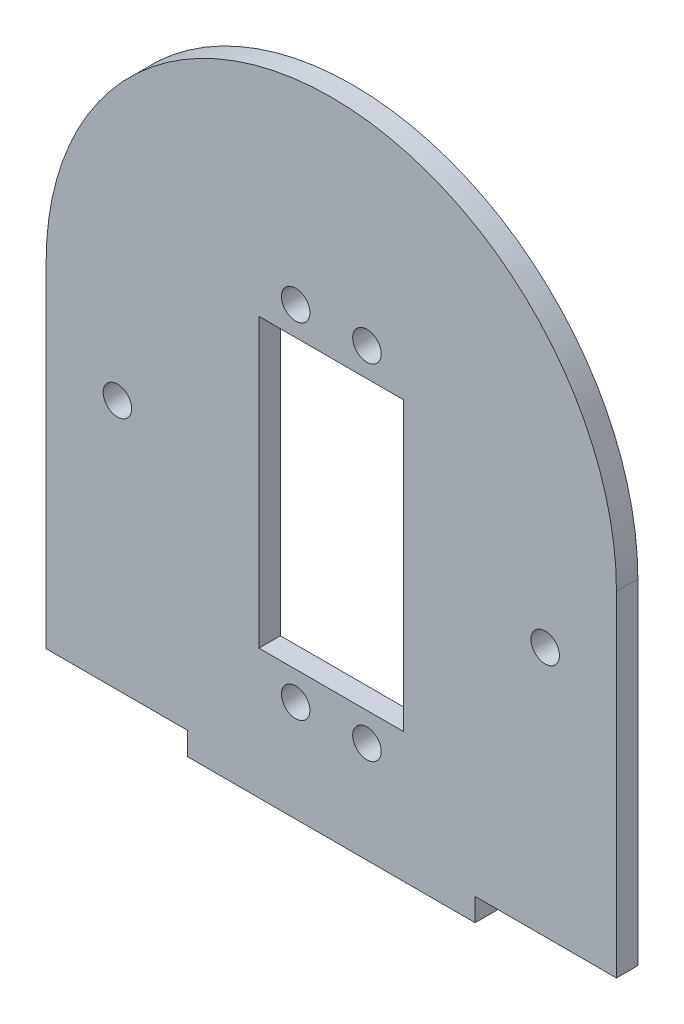
ISO-10303-21;
HEADER;
FILE_DESCRIPTION(('STEP AP214'),'2;1');
FILE_NAME('part.step','',(''),(''),'','','');
FILE_SCHEMA(('AUTOMOTIVE_DESIGN { 1 0 10303 214 1 1 1 1 }'));
ENDSEC;
DATA;
#1=APPLICATION_CONTEXT('core data for automotive mechanical design processes');
#2=APPLICATION_PROTOCOL_DEFINITION('international standard','automotive_design',2000,#1);
#3=PRODUCT_CONTEXT('',#1,'mechanical');
#4=PRODUCT('Part','Part','',(#3));
#5=PRODUCT_RELATED_PRODUCT_CATEGORY('part','',(#4));
#6=PRODUCT_DEFINITION_FORMATION('','',#4);
#7=PRODUCT_DEFINITION_CONTEXT('part definition',#1,'design');
#8=PRODUCT_DEFINITION('design','',#6,#7);
#9=PRODUCT_DEFINITION_SHAPE('','',#8);
#10=(LENGTH_UNIT() NAMED_UNIT(*) SI_UNIT(.MILLI.,.METRE.));
#11=(NAMED_UNIT(*) PLANE_ANGLE_UNIT() SI_UNIT($,.RADIAN.));
#12=(NAMED_UNIT(*) SI_UNIT($,.STERADIAN.) SOLID_ANGLE_UNIT());
#13=UNCERTAINTY_MEASURE_WITH_UNIT(LENGTH_MEASURE(1.E-05),#10,'distance_accuracy_value','');
#14=(GEOMETRIC_REPRESENTATION_CONTEXT(3) GLOBAL_UNCERTAINTY_ASSIGNED_CONTEXT((#13)) GLOBAL_UNIT_ASSIGNED_CONTEXT((#10,
#11,#12)) REPRESENTATION_CONTEXT('',''));
#15=CARTESIAN_POINT('',(0.,0.,0.));
#16=DIRECTION('',(0.,0.,1.));
#17=DIRECTION('',(1.,0.,0.));
#18=AXIS2_PLACEMENT_3D('',#15,#16,#17);
#19=CARTESIAN_POINT('',(0.,0.,3.));
#20=DIRECTION('',(0.,0.,1.));
#21=DIRECTION('',(1.,0.,0.));
#22=AXIS2_PLACEMENT_3D('',#19,#20,#21);
#23=PLANE('',#22);
#24=CARTESIAN_POINT('',(-30.,-11.85,3.));
#25=DIRECTION('',(0.,0.,1.));
#26=DIRECTION('',(1.,0.,0.));
#27=AXIS2_PLACEMENT_3D('',#24,#25,#26);
#28=CIRCLE('',#27,2.);
#29=CARTESIAN_POINT('',(-28.,-11.85,3.));
#30=VERTEX_POINT('',#29);
#31=EDGE_CURVE('E375',#30,#30,#28,.T.);
#32=ORIENTED_EDGE('',*,*,#31,.F.);
#33=EDGE_LOOP('',(#32));
#34=FACE_BOUND('',#33,.T.);
#35=CARTESIAN_POINT('',(5.,-36.,3.));
#36=DIRECTION('',(0.,0.,1.));
#37=DIRECTION('',(1.,0.,0.));
#38=AXIS2_PLACEMENT_3D('',#35,#36,#37);
#39=CIRCLE('',#38,2.);
#40=CARTESIAN_POINT('',(7.,-36.,3.));
#41=VERTEX_POINT('',#40);
#42=EDGE_CURVE('E391',#41,#41,#39,.T.);
#43=ORIENTED_EDGE('',*,*,#42,.F.);
#44=EDGE_LOOP('',(#43));
#45=FACE_BOUND('',#44,.T.);
#46=CARTESIAN_POINT('',(-5.,12.3,3.));
#47=DIRECTION('',(0.,0.,1.));
#48=DIRECTION('',(1.,0.,0.));
#49=AXIS2_PLACEMENT_3D('',#46,#47,#48);
#50=CIRCLE('',#49,2.);
#51=CARTESIAN_POINT('',(-3.,12.3,3.));
#52=VERTEX_POINT('',#51);
#53=EDGE_CURVE('E168',#52,#52,#50,.T.);
#54=ORIENTED_EDGE('',*,*,#53,.F.);
#55=EDGE_LOOP('',(#54));
#56=FACE_BOUND('',#55,.T.);
#57=DIRECTION('',(1.,0.,0.));
#58=VECTOR('',#57,1.);
#59=CARTESIAN_POINT('',(-40.,-47.,3.));
#60=LINE('',#59,#58);
#61=CARTESIAN_POINT('',(-40.,-47.,3.));
#62=VERTEX_POINT('',#61);
#63=CARTESIAN_POINT('',(-20.175,-47.,3.));
#64=VERTEX_POINT('',#63);
#65=EDGE_CURVE('E184',#62,#64,#60,.T.);
#66=ORIENTED_EDGE('',*,*,#65,.T.);
#67=DIRECTION('',(0.,-1.,0.));
#68=VECTOR('',#67,1.);
#69=CARTESIAN_POINT('',(-20.175,-47.,3.));
#70=LINE('',#69,#68);
#71=CARTESIAN_POINT('',(-20.175,-50.2,3.));
#72=VERTEX_POINT('',#71);
#73=EDGE_CURVE('E188',#64,#72,#70,.T.);
#74=ORIENTED_EDGE('',*,*,#73,.T.);
#75=DIRECTION('',(1.,0.,0.));
#76=VECTOR('',#75,1.);
#77=CARTESIAN_POINT('',(-20.175,-50.2,3.));
#78=LINE('',#77,#76);
#79=CARTESIAN_POINT('',(20.175,-50.2,3.));
#80=VERTEX_POINT('',#79);
#81=EDGE_CURVE('E192',#72,#80,#78,.T.);
#82=ORIENTED_EDGE('',*,*,#81,.T.);
#83=DIRECTION('',(0.,1.,0.));
#84=VECTOR('',#83,1.);
#85=CARTESIAN_POINT('',(20.175,-50.2,3.));
#86=LINE('',#85,#84);
#87=CARTESIAN_POINT('',(20.175,-47.,3.));
#88=VERTEX_POINT('',#87);
#89=EDGE_CURVE('E195',#80,#88,#86,.T.);
#90=ORIENTED_EDGE('',*,*,#89,.T.);
#91=DIRECTION('',(1.,0.,0.));
#92=VECTOR('',#91,1.);
#93=CARTESIAN_POINT('',(20.175,-47.,3.));
#94=LINE('',#93,#92);
#95=CARTESIAN_POINT('',(40.,-47.,3.));
#96=VERTEX_POINT('',#95);
#97=EDGE_CURVE('E198',#88,#96,#94,.T.);
#98=ORIENTED_EDGE('',*,*,#97,.T.);
#99=DIRECTION('',(0.,1.,0.));
#100=VECTOR('',#99,1.);
#101=CARTESIAN_POINT('',(40.,0.,3.));
#102=LINE('',#101,#100);
#103=CARTESIAN_POINT('',(40.,0.,3.));
#104=VERTEX_POINT('',#103);
#105=EDGE_CURVE('E201',#96,#104,#102,.T.);
#106=ORIENTED_EDGE('',*,*,#105,.T.);
#107=CARTESIAN_POINT('',(0.,0.,3.));
#108=DIRECTION('',(0.,0.,1.));
#109=DIRECTION('',(1.,0.,0.));
#110=AXIS2_PLACEMENT_3D('',#107,#108,#109);
#111=CIRCLE('',#110,40.);
#112=CARTESIAN_POINT('',(-40.,0.,3.));
#113=VERTEX_POINT('',#112);
#114=EDGE_CURVE('E204',#104,#113,#111,.T.);
#115=ORIENTED_EDGE('',*,*,#114,.T.);
#116=DIRECTION('',(0.,-1.,0.));
#117=VECTOR('',#116,1.);
#118=CARTESIAN_POINT('',(-40.,0.,3.));
#119=LINE('',#118,#117);
#120=EDGE_CURVE('E207',#113,#62,#119,.T.);
#121=ORIENTED_EDGE('',*,*,#120,.T.);
#122=EDGE_LOOP('',(#66,#74,#82,#90,#98,#106,#115,#121));
#123=FACE_BOUND('',#122,.T.);
#124=DIRECTION('',(-1.,0.,0.));
#125=VECTOR('',#124,1.);
#126=CARTESIAN_POINT('',(-10.15,8.3,3.));
#127=LINE('',#126,#125);
#128=CARTESIAN_POINT('',(10.15,8.3,3.));
#129=VERTEX_POINT('',#128);
#130=CARTESIAN_POINT('',(-10.15,8.3,3.));
#131=VERTEX_POINT('',#130);
#132=EDGE_CURVE('E142',#129,#131,#127,.T.);
#133=ORIENTED_EDGE('',*,*,#132,.F.);
#134=DIRECTION('',(0.,1.,0.));
#135=VECTOR('',#134,1.);
#136=CARTESIAN_POINT('',(10.15,8.3,3.));
#137=LINE('',#136,#135);
#138=CARTESIAN_POINT('',(10.15,-32.,3.));
#139=VERTEX_POINT('',#138);
#140=EDGE_CURVE('E133',#139,#129,#137,.T.);
#141=ORIENTED_EDGE('',*,*,#140,.F.);
#142=DIRECTION('',(1.,0.,0.));
#143=VECTOR('',#142,1.);
#144=CARTESIAN_POINT('',(-10.15,-32.,3.));
#145=LINE('',#144,#143);
#146=CARTESIAN_POINT('',(-10.15,-32.,3.));
#147=VERTEX_POINT('',#146);
#148=EDGE_CURVE('E160',#147,#139,#145,.T.);
#149=ORIENTED_EDGE('',*,*,#148,.F.);
#150=DIRECTION('',(0.,-1.,0.));
#151=VECTOR('',#150,1.);
#152=CARTESIAN_POINT('',(-10.15,8.3,3.));
#153=LINE('',#152,#151);
#154=EDGE_CURVE('E156',#131,#147,#153,.T.);
#155=ORIENTED_EDGE('',*,*,#154,.F.);
#156=EDGE_LOOP('',(#133,#141,#149,#155));
#157=FACE_BOUND('',#156,.T.);
#158=CARTESIAN_POINT('',(5.,12.3,3.));
#159=DIRECTION('',(0.,0.,1.));
#160=DIRECTION('',(-1.,0.,0.));
#161=AXIS2_PLACEMENT_3D('',#158,#159,#160);
#162=CIRCLE('',#161,2.);
#163=CARTESIAN_POINT('',(3.,12.3,3.));
#164=VERTEX_POINT('',#163);
#165=EDGE_CURVE('E399',#164,#164,#162,.T.);
#166=ORIENTED_EDGE('',*,*,#165,.F.);
#167=EDGE_LOOP('',(#166));
#168=FACE_BOUND('',#167,.T.);
#169=CARTESIAN_POINT('',(-5.,-36.,3.));
#170=DIRECTION('',(0.,0.,1.));
#171=DIRECTION('',(-1.,0.,0.));
#172=AXIS2_PLACEMENT_3D('',#169,#170,#171);
#173=CIRCLE('',#172,2.);
#174=CARTESIAN_POINT('',(-7.,-36.,3.));
#175=VERTEX_POINT('',#174);
#176=EDGE_CURVE('E383',#175,#175,#173,.T.);
#177=ORIENTED_EDGE('',*,*,#176,.F.);
#178=EDGE_LOOP('',(#177));
#179=FACE_BOUND('',#178,.T.);
#180=CARTESIAN_POINT('',(30.,-11.85,3.));
#181=DIRECTION('',(0.,0.,1.));
#182=DIRECTION('',(-1.,0.,0.));
#183=AXIS2_PLACEMENT_3D('',#180,#181,#182);
#184=CIRCLE('',#183,2.00000000000001);
#185=CARTESIAN_POINT('',(28.,-11.85,3.));
#186=VERTEX_POINT('',#185);
#187=EDGE_CURVE('E364',#186,#186,#184,.T.);
#188=ORIENTED_EDGE('',*,*,#187,.F.);
#189=EDGE_LOOP('',(#188));
#190=FACE_BOUND('',#189,.T.);
#191=ADVANCED_FACE('F43',(#34,#45,#56,#123,#157,#168,#179,#190),#23,.T.);
#192=CARTESIAN_POINT('',(0.,0.,0.));
#193=DIRECTION('',(0.,0.,1.));
#194=DIRECTION('',(1.,0.,0.));
#195=AXIS2_PLACEMENT_3D('',#192,#193,#194);
#196=PLANE('',#195);
#197=DIRECTION('',(1.,0.,0.));
#198=VECTOR('',#197,1.);
#199=CARTESIAN_POINT('',(-40.,-47.,0.));
#200=LINE('',#199,#198);
#201=CARTESIAN_POINT('',(-40.,-47.,0.));
#202=VERTEX_POINT('',#201);
#203=CARTESIAN_POINT('',(-20.175,-47.,0.));
#204=VERTEX_POINT('',#203);
#205=EDGE_CURVE('E151',#202,#204,#200,.T.);
#206=ORIENTED_EDGE('',*,*,#205,.F.);
#207=DIRECTION('',(0.,-1.,0.));
#208=VECTOR('',#207,1.);
#209=CARTESIAN_POINT('',(-40.,0.,0.));
#210=LINE('',#209,#208);
#211=CARTESIAN_POINT('',(-40.,0.,0.));
#212=VERTEX_POINT('',#211);
#213=EDGE_CURVE('E189',#212,#202,#210,.T.);
#214=ORIENTED_EDGE('',*,*,#213,.F.);
#215=CARTESIAN_POINT('',(0.,0.,0.));
#216=DIRECTION('',(0.,0.,1.));
#217=DIRECTION('',(-1.,0.,0.));
#218=AXIS2_PLACEMENT_3D('',#215,#216,#217);
#219=CIRCLE('',#218,40.);
#220=CARTESIAN_POINT('',(40.,0.,0.));
#221=VERTEX_POINT('',#220);
#222=EDGE_CURVE('E230',#221,#212,#219,.T.);
#223=ORIENTED_EDGE('',*,*,#222,.F.);
#224=DIRECTION('',(0.,1.,0.));
#225=VECTOR('',#224,1.);
#226=CARTESIAN_POINT('',(40.,0.,0.));
#227=LINE('',#226,#225);
#228=CARTESIAN_POINT('',(40.,-47.,0.));
#229=VERTEX_POINT('',#228);
#230=EDGE_CURVE('E226',#229,#221,#227,.T.);
#231=ORIENTED_EDGE('',*,*,#230,.F.);
#232=DIRECTION('',(1.,0.,0.));
#233=VECTOR('',#232,1.);
#234=CARTESIAN_POINT('',(20.175,-47.,0.));
#235=LINE('',#234,#233);
#236=CARTESIAN_POINT('',(20.175,-47.,0.));
#237=VERTEX_POINT('',#236);
#238=EDGE_CURVE('E223',#237,#229,#235,.T.);
#239=ORIENTED_EDGE('',*,*,#238,.F.);
#240=DIRECTION('',(0.,1.,0.));
#241=VECTOR('',#240,1.);
#242=CARTESIAN_POINT('',(20.175,-50.2,0.));
#243=LINE('',#242,#241);
#244=CARTESIAN_POINT('',(20.175,-50.2,0.));
#245=VERTEX_POINT('',#244);
#246=EDGE_CURVE('E220',#245,#237,#243,.T.);
#247=ORIENTED_EDGE('',*,*,#246,.F.);
#248=DIRECTION('',(1.,0.,0.));
#249=VECTOR('',#248,1.);
#250=CARTESIAN_POINT('',(-20.175,-50.2,0.));
#251=LINE('',#250,#249);
#252=CARTESIAN_POINT('',(-20.175,-50.2,0.));
#253=VERTEX_POINT('',#252);
#254=EDGE_CURVE('E217',#253,#245,#251,.T.);
#255=ORIENTED_EDGE('',*,*,#254,.F.);
#256=DIRECTION('',(0.,-1.,0.));
#257=VECTOR('',#256,1.);
#258=CARTESIAN_POINT('',(-20.175,-47.,0.));
#259=LINE('',#258,#257);
#260=EDGE_CURVE('E214',#204,#253,#259,.T.);
#261=ORIENTED_EDGE('',*,*,#260,.F.);
#262=EDGE_LOOP('',(#206,#214,#223,#231,#239,#247,#255,#261));
#263=FACE_BOUND('',#262,.T.);
#264=DIRECTION('',(0.,1.,0.));
#265=VECTOR('',#264,1.);
#266=CARTESIAN_POINT('',(10.15,8.3,0.));
#267=LINE('',#266,#265);
#268=CARTESIAN_POINT('',(10.15,-32.,0.));
#269=VERTEX_POINT('',#268);
#270=CARTESIAN_POINT('',(10.15,8.3,0.));
#271=VERTEX_POINT('',#270);
#272=EDGE_CURVE('E67',#269,#271,#267,.T.);
#273=ORIENTED_EDGE('',*,*,#272,.T.);
#274=DIRECTION('',(-1.,0.,0.));
#275=VECTOR('',#274,1.);
#276=CARTESIAN_POINT('',(-10.15,8.3,0.));
#277=LINE('',#276,#275);
#278=CARTESIAN_POINT('',(-10.15,8.3,0.));
#279=VERTEX_POINT('',#278);
#280=EDGE_CURVE('E149',#271,#279,#277,.T.);
#281=ORIENTED_EDGE('',*,*,#280,.T.);
#282=DIRECTION('',(0.,-1.,0.));
#283=VECTOR('',#282,1.);
#284=CARTESIAN_POINT('',(-10.15,8.3,0.));
#285=LINE('',#284,#283);
#286=CARTESIAN_POINT('',(-10.15,-32.,0.));
#287=VERTEX_POINT('',#286);
#288=EDGE_CURVE('E171',#279,#287,#285,.T.);
#289=ORIENTED_EDGE('',*,*,#288,.T.);
#290=DIRECTION('',(1.,0.,0.));
#291=VECTOR('',#290,1.);
#292=CARTESIAN_POINT('',(-10.15,-32.,0.));
#293=LINE('',#292,#291);
#294=EDGE_CURVE('E143',#287,#269,#293,.T.);
#295=ORIENTED_EDGE('',*,*,#294,.T.);
#296=EDGE_LOOP('',(#273,#281,#289,#295));
#297=FACE_BOUND('',#296,.T.);
#298=CARTESIAN_POINT('',(-5.,12.3,0.));
#299=DIRECTION('',(0.,0.,1.));
#300=DIRECTION('',(1.,0.,0.));
#301=AXIS2_PLACEMENT_3D('',#298,#299,#300);
#302=CIRCLE('',#301,2.);
#303=CARTESIAN_POINT('',(-3.,12.3,0.));
#304=VERTEX_POINT('',#303);
#305=EDGE_CURVE('E403',#304,#304,#302,.T.);
#306=ORIENTED_EDGE('',*,*,#305,.T.);
#307=EDGE_LOOP('',(#306));
#308=FACE_BOUND('',#307,.T.);
#309=CARTESIAN_POINT('',(5.,12.3,0.));
#310=DIRECTION('',(0.,0.,1.));
#311=DIRECTION('',(-1.,0.,0.));
#312=AXIS2_PLACEMENT_3D('',#309,#310,#311);
#313=CIRCLE('',#312,2.);
#314=CARTESIAN_POINT('',(3.,12.3,0.));
#315=VERTEX_POINT('',#314);
#316=EDGE_CURVE('E395',#315,#315,#313,.T.);
#317=ORIENTED_EDGE('',*,*,#316,.T.);
#318=EDGE_LOOP('',(#317));
#319=FACE_BOUND('',#318,.T.);
#320=CARTESIAN_POINT('',(5.,-36.,0.));
#321=DIRECTION('',(0.,0.,1.));
#322=DIRECTION('',(1.,0.,0.));
#323=AXIS2_PLACEMENT_3D('',#320,#321,#322);
#324=CIRCLE('',#323,2.);
#325=CARTESIAN_POINT('',(7.,-36.,0.));
#326=VERTEX_POINT('',#325);
#327=EDGE_CURVE('E387',#326,#326,#324,.T.);
#328=ORIENTED_EDGE('',*,*,#327,.T.);
#329=EDGE_LOOP('',(#328));
#330=FACE_BOUND('',#329,.T.);
#331=CARTESIAN_POINT('',(-5.,-36.,0.));
#332=DIRECTION('',(0.,0.,1.));
#333=DIRECTION('',(-1.,0.,0.));
#334=AXIS2_PLACEMENT_3D('',#331,#332,#333);
#335=CIRCLE('',#334,2.);
#336=CARTESIAN_POINT('',(-7.,-36.,0.));
#337=VERTEX_POINT('',#336);
#338=EDGE_CURVE('E379',#337,#337,#335,.T.);
#339=ORIENTED_EDGE('',*,*,#338,.T.);
#340=EDGE_LOOP('',(#339));
#341=FACE_BOUND('',#340,.T.);
#342=CARTESIAN_POINT('',(-30.,-11.85,0.));
#343=DIRECTION('',(0.,0.,1.));
#344=DIRECTION('',(1.,0.,0.));
#345=AXIS2_PLACEMENT_3D('',#342,#343,#344);
#346=CIRCLE('',#345,2.);
#347=CARTESIAN_POINT('',(-28.,-11.85,0.));
#348=VERTEX_POINT('',#347);
#349=EDGE_CURVE('E372',#348,#348,#346,.T.);
#350=ORIENTED_EDGE('',*,*,#349,.T.);
#351=EDGE_LOOP('',(#350));
#352=FACE_BOUND('',#351,.T.);
#353=CARTESIAN_POINT('',(30.,-11.85,0.));
#354=DIRECTION('',(0.,0.,1.));
#355=DIRECTION('',(-1.,0.,0.));
#356=AXIS2_PLACEMENT_3D('',#353,#354,#355);
#357=CIRCLE('',#356,2.00000000000001);
#358=CARTESIAN_POINT('',(28.,-11.85,0.));
#359=VERTEX_POINT('',#358);
#360=EDGE_CURVE('E367',#359,#359,#357,.T.);
#361=ORIENTED_EDGE('',*,*,#360,.T.);
#362=EDGE_LOOP('',(#361));
#363=FACE_BOUND('',#362,.T.);
#364=ADVANCED_FACE('F269',(#263,#297,#308,#319,#330,#341,#352,#363),#196,.F.);
#365=CARTESIAN_POINT('',(-40.,-47.,3.));
#366=DIRECTION('',(0.,1.,0.));
#367=DIRECTION('',(0.,0.,1.));
#368=AXIS2_PLACEMENT_3D('',#365,#366,#367);
#369=PLANE('',#368);
#370=ORIENTED_EDGE('',*,*,#205,.T.);
#371=DIRECTION('',(0.,0.,-1.));
#372=VECTOR('',#371,1.);
#373=CARTESIAN_POINT('',(-20.175,-47.,3.));
#374=LINE('',#373,#372);
#375=EDGE_CURVE('E11',#64,#204,#374,.T.);
#376=ORIENTED_EDGE('',*,*,#375,.F.);
#377=ORIENTED_EDGE('',*,*,#65,.F.);
#378=DIRECTION('',(0.,0.,-1.));
#379=VECTOR('',#378,1.);
#380=CARTESIAN_POINT('',(-40.,-47.,3.));
#381=LINE('',#380,#379);
#382=EDGE_CURVE('E210',#62,#202,#381,.T.);
#383=ORIENTED_EDGE('',*,*,#382,.T.);
#384=EDGE_LOOP('',(#370,#376,#377,#383));
#385=FACE_BOUND('',#384,.T.);
#386=ADVANCED_FACE('F45',(#385),#369,.F.);
#387=CARTESIAN_POINT('',(-20.175,-47.,3.));
#388=DIRECTION('',(1.,0.,0.));
#389=DIRECTION('',(0.,0.,-1.));
#390=AXIS2_PLACEMENT_3D('',#387,#388,#389);
#391=PLANE('',#390);
#392=ORIENTED_EDGE('',*,*,#260,.T.);
#393=DIRECTION('',(0.,0.,-1.));
#394=VECTOR('',#393,1.);
#395=CARTESIAN_POINT('',(-20.175,-50.2,3.));
#396=LINE('',#395,#394);
#397=EDGE_CURVE('E52',#72,#253,#396,.T.);
#398=ORIENTED_EDGE('',*,*,#397,.F.);
#399=ORIENTED_EDGE('',*,*,#73,.F.);
#400=ORIENTED_EDGE('',*,*,#375,.T.);
#401=EDGE_LOOP('',(#392,#398,#399,#400));
#402=FACE_BOUND('',#401,.T.);
#403=ADVANCED_FACE('F286',(#402),#391,.F.);
#404=CARTESIAN_POINT('',(-20.175,-50.2,3.));
#405=DIRECTION('',(0.,1.,0.));
#406=DIRECTION('',(-1.,0.,0.));
#407=AXIS2_PLACEMENT_3D('',#404,#405,#406);
#408=PLANE('',#407);
#409=ORIENTED_EDGE('',*,*,#254,.T.);
#410=DIRECTION('',(0.,0.,-1.));
#411=VECTOR('',#410,1.);
#412=CARTESIAN_POINT('',(20.175,-50.2,3.));
#413=LINE('',#412,#411);
#414=EDGE_CURVE('E254',#80,#245,#413,.T.);
#415=ORIENTED_EDGE('',*,*,#414,.F.);
#416=ORIENTED_EDGE('',*,*,#81,.F.);
#417=ORIENTED_EDGE('',*,*,#397,.T.);
#418=EDGE_LOOP('',(#409,#415,#416,#417));
#419=FACE_BOUND('',#418,.T.);
#420=ADVANCED_FACE('F263',(#419),#408,.F.);
#421=CARTESIAN_POINT('',(20.175,-50.2,3.));
#422=DIRECTION('',(-1.,0.,0.));
#423=DIRECTION('',(0.,0.,1.));
#424=AXIS2_PLACEMENT_3D('',#421,#422,#423);
#425=PLANE('',#424);
#426=ORIENTED_EDGE('',*,*,#246,.T.);
#427=DIRECTION('',(0.,0.,-1.));
#428=VECTOR('',#427,1.);
#429=CARTESIAN_POINT('',(20.175,-47.,3.));
#430=LINE('',#429,#428);
#431=EDGE_CURVE('E250',#88,#237,#430,.T.);
#432=ORIENTED_EDGE('',*,*,#431,.F.);
#433=ORIENTED_EDGE('',*,*,#89,.F.);
#434=ORIENTED_EDGE('',*,*,#414,.T.);
#435=EDGE_LOOP('',(#426,#432,#433,#434));
#436=FACE_BOUND('',#435,.T.);
#437=ADVANCED_FACE('F275',(#436),#425,.F.);
#438=CARTESIAN_POINT('',(20.175,-47.,3.));
#439=DIRECTION('',(0.,1.,0.));
#440=DIRECTION('',(0.,0.,1.));
#441=AXIS2_PLACEMENT_3D('',#438,#439,#440);
#442=PLANE('',#441);
#443=ORIENTED_EDGE('',*,*,#238,.T.);
#444=DIRECTION('',(0.,0.,-1.));
#445=VECTOR('',#444,1.);
#446=CARTESIAN_POINT('',(40.,-47.,3.));
#447=LINE('',#446,#445);
#448=EDGE_CURVE('E246',#96,#229,#447,.T.);
#449=ORIENTED_EDGE('',*,*,#448,.F.);
#450=ORIENTED_EDGE('',*,*,#97,.F.);
#451=ORIENTED_EDGE('',*,*,#431,.T.);
#452=EDGE_LOOP('',(#443,#449,#450,#451));
#453=FACE_BOUND('',#452,.T.);
#454=ADVANCED_FACE('F279',(#453),#442,.F.);
#455=CARTESIAN_POINT('',(40.,0.,3.));
#456=DIRECTION('',(-1.,0.,0.));
#457=DIRECTION('',(0.,-1.,0.));
#458=AXIS2_PLACEMENT_3D('',#455,#456,#457);
#459=PLANE('',#458);
#460=ORIENTED_EDGE('',*,*,#230,.T.);
#461=DIRECTION('',(0.,0.,-1.));
#462=VECTOR('',#461,1.);
#463=CARTESIAN_POINT('',(40.,0.,3.));
#464=LINE('',#463,#462);
#465=EDGE_CURVE('E242',#104,#221,#464,.T.);
#466=ORIENTED_EDGE('',*,*,#465,.F.);
#467=ORIENTED_EDGE('',*,*,#105,.F.);
#468=ORIENTED_EDGE('',*,*,#448,.T.);
#469=EDGE_LOOP('',(#460,#466,#467,#468));
#470=FACE_BOUND('',#469,.T.);
#471=ADVANCED_FACE('F298',(#470),#459,.F.);
#472=CARTESIAN_POINT('',(0.,0.,3.));
#473=DIRECTION('',(0.,0.,-1.));
#474=DIRECTION('',(-1.,0.,0.));
#475=AXIS2_PLACEMENT_3D('',#472,#473,#474);
#476=CYLINDRICAL_SURFACE('',#475,40.);
#477=ORIENTED_EDGE('',*,*,#222,.T.);
#478=DIRECTION('',(0.,0.,-1.));
#479=VECTOR('',#478,1.);
#480=CARTESIAN_POINT('',(-40.,0.,3.));
#481=LINE('',#480,#479);
#482=EDGE_CURVE('E238',#113,#212,#481,.T.);
#483=ORIENTED_EDGE('',*,*,#482,.F.);
#484=ORIENTED_EDGE('',*,*,#114,.F.);
#485=ORIENTED_EDGE('',*,*,#465,.T.);
#486=EDGE_LOOP('',(#477,#483,#484,#485));
#487=FACE_BOUND('',#486,.T.);
#488=ADVANCED_FACE('F296',(#487),#476,.T.);
#489=CARTESIAN_POINT('',(-40.,0.,3.));
#490=DIRECTION('',(1.,0.,0.));
#491=DIRECTION('',(0.,0.,-1.));
#492=AXIS2_PLACEMENT_3D('',#489,#490,#491);
#493=PLANE('',#492);
#494=ORIENTED_EDGE('',*,*,#213,.T.);
#495=ORIENTED_EDGE('',*,*,#382,.F.);
#496=ORIENTED_EDGE('',*,*,#120,.F.);
#497=ORIENTED_EDGE('',*,*,#482,.T.);
#498=EDGE_LOOP('',(#494,#495,#496,#497));
#499=FACE_BOUND('',#498,.T.);
#500=ADVANCED_FACE('F291',(#499),#493,.F.);
#501=CARTESIAN_POINT('',(10.15,8.3,3.));
#502=DIRECTION('',(-1.,0.,0.));
#503=DIRECTION('',(0.,-1.,0.));
#504=AXIS2_PLACEMENT_3D('',#501,#502,#503);
#505=PLANE('',#504);
#506=ORIENTED_EDGE('',*,*,#272,.F.);
#507=DIRECTION('',(0.,0.,-1.));
#508=VECTOR('',#507,1.);
#509=CARTESIAN_POINT('',(10.15,-32.,3.));
#510=LINE('',#509,#508);
#511=EDGE_CURVE('E137',#139,#269,#510,.T.);
#512=ORIENTED_EDGE('',*,*,#511,.F.);
#513=ORIENTED_EDGE('',*,*,#140,.T.);
#514=DIRECTION('',(0.,0.,-1.));
#515=VECTOR('',#514,1.);
#516=CARTESIAN_POINT('',(10.15,8.3,3.));
#517=LINE('',#516,#515);
#518=EDGE_CURVE('E136',#129,#271,#517,.T.);
#519=ORIENTED_EDGE('',*,*,#518,.T.);
#520=EDGE_LOOP('',(#506,#512,#513,#519));
#521=FACE_BOUND('',#520,.T.);
#522=ADVANCED_FACE('F135',(#521),#505,.T.);
#523=CARTESIAN_POINT('',(-10.15,8.3,3.));
#524=DIRECTION('',(0.,-1.,0.));
#525=DIRECTION('',(0.,0.,-1.));
#526=AXIS2_PLACEMENT_3D('',#523,#524,#525);
#527=PLANE('',#526);
#528=ORIENTED_EDGE('',*,*,#280,.F.);
#529=ORIENTED_EDGE('',*,*,#518,.F.);
#530=ORIENTED_EDGE('',*,*,#132,.T.);
#531=DIRECTION('',(0.,0.,-1.));
#532=VECTOR('',#531,1.);
#533=CARTESIAN_POINT('',(-10.15,8.3,3.));
#534=LINE('',#533,#532);
#535=EDGE_CURVE('E152',#131,#279,#534,.T.);
#536=ORIENTED_EDGE('',*,*,#535,.T.);
#537=EDGE_LOOP('',(#528,#529,#530,#536));
#538=FACE_BOUND('',#537,.T.);
#539=ADVANCED_FACE('F146',(#538),#527,.T.);
#540=CARTESIAN_POINT('',(-10.15,8.3,3.));
#541=DIRECTION('',(1.,0.,0.));
#542=DIRECTION('',(0.,1.,0.));
#543=AXIS2_PLACEMENT_3D('',#540,#541,#542);
#544=PLANE('',#543);
#545=ORIENTED_EDGE('',*,*,#288,.F.);
#546=ORIENTED_EDGE('',*,*,#535,.F.);
#547=ORIENTED_EDGE('',*,*,#154,.T.);
#548=DIRECTION('',(0.,0.,-1.));
#549=VECTOR('',#548,1.);
#550=CARTESIAN_POINT('',(-10.15,-32.,3.));
#551=LINE('',#550,#549);
#552=EDGE_CURVE('E59',#147,#287,#551,.T.);
#553=ORIENTED_EDGE('',*,*,#552,.T.);
#554=EDGE_LOOP('',(#545,#546,#547,#553));
#555=FACE_BOUND('',#554,.T.);
#556=ADVANCED_FACE('F326',(#555),#544,.T.);
#557=CARTESIAN_POINT('',(-10.15,-32.,3.));
#558=DIRECTION('',(0.,1.,0.));
#559=DIRECTION('',(0.,0.,1.));
#560=AXIS2_PLACEMENT_3D('',#557,#558,#559);
#561=PLANE('',#560);
#562=ORIENTED_EDGE('',*,*,#294,.F.);
#563=ORIENTED_EDGE('',*,*,#552,.F.);
#564=ORIENTED_EDGE('',*,*,#148,.T.);
#565=ORIENTED_EDGE('',*,*,#511,.T.);
#566=EDGE_LOOP('',(#562,#563,#564,#565));
#567=FACE_BOUND('',#566,.T.);
#568=ADVANCED_FACE('F330',(#567),#561,.T.);
#569=CARTESIAN_POINT('',(-5.,12.3,3.));
#570=DIRECTION('',(0.,0.,-1.));
#571=DIRECTION('',(-1.,0.,0.));
#572=AXIS2_PLACEMENT_3D('',#569,#570,#571);
#573=CYLINDRICAL_SURFACE('',#572,2.);
#574=ORIENTED_EDGE('',*,*,#53,.T.);
#575=EDGE_LOOP('',(#574));
#576=FACE_BOUND('',#575,.T.);
#577=ORIENTED_EDGE('',*,*,#305,.F.);
#578=EDGE_LOOP('',(#577));
#579=FACE_BOUND('',#578,.T.);
#580=ADVANCED_FACE('F336',(#576,#579),#573,.F.);
#581=CARTESIAN_POINT('',(5.,12.3,3.));
#582=DIRECTION('',(0.,0.,-1.));
#583=DIRECTION('',(-1.,0.,0.));
#584=AXIS2_PLACEMENT_3D('',#581,#582,#583);
#585=CYLINDRICAL_SURFACE('',#584,2.);
#586=ORIENTED_EDGE('',*,*,#165,.T.);
#587=EDGE_LOOP('',(#586));
#588=FACE_BOUND('',#587,.T.);
#589=ORIENTED_EDGE('',*,*,#316,.F.);
#590=EDGE_LOOP('',(#589));
#591=FACE_BOUND('',#590,.T.);
#592=ADVANCED_FACE('F339',(#588,#591),#585,.F.);
#593=CARTESIAN_POINT('',(5.,-36.,3.));
#594=DIRECTION('',(0.,0.,-1.));
#595=DIRECTION('',(-1.,0.,0.));
#596=AXIS2_PLACEMENT_3D('',#593,#594,#595);
#597=CYLINDRICAL_SURFACE('',#596,2.);
#598=ORIENTED_EDGE('',*,*,#42,.T.);
#599=EDGE_LOOP('',(#598));
#600=FACE_BOUND('',#599,.T.);
#601=ORIENTED_EDGE('',*,*,#327,.F.);
#602=EDGE_LOOP('',(#601));
#603=FACE_BOUND('',#602,.T.);
#604=ADVANCED_FACE('F343',(#600,#603),#597,.F.);
#605=CARTESIAN_POINT('',(-5.,-36.,3.));
#606=DIRECTION('',(0.,0.,-1.));
#607=DIRECTION('',(-1.,0.,0.));
#608=AXIS2_PLACEMENT_3D('',#605,#606,#607);
#609=CYLINDRICAL_SURFACE('',#608,2.);
#610=ORIENTED_EDGE('',*,*,#176,.T.);
#611=EDGE_LOOP('',(#610));
#612=FACE_BOUND('',#611,.T.);
#613=ORIENTED_EDGE('',*,*,#338,.F.);
#614=EDGE_LOOP('',(#613));
#615=FACE_BOUND('',#614,.T.);
#616=ADVANCED_FACE('F347',(#612,#615),#609,.F.);
#617=CARTESIAN_POINT('',(-30.,-11.85,3.));
#618=DIRECTION('',(0.,0.,-1.));
#619=DIRECTION('',(-1.,0.,0.));
#620=AXIS2_PLACEMENT_3D('',#617,#618,#619);
#621=CYLINDRICAL_SURFACE('',#620,2.);
#622=ORIENTED_EDGE('',*,*,#31,.T.);
#623=EDGE_LOOP('',(#622));
#624=FACE_BOUND('',#623,.T.);
#625=ORIENTED_EDGE('',*,*,#349,.F.);
#626=EDGE_LOOP('',(#625));
#627=FACE_BOUND('',#626,.T.);
#628=ADVANCED_FACE('F351',(#624,#627),#621,.F.);
#629=CARTESIAN_POINT('',(30.,-11.85,3.));
#630=DIRECTION('',(0.,0.,-1.));
#631=DIRECTION('',(-1.,0.,0.));
#632=AXIS2_PLACEMENT_3D('',#629,#630,#631);
#633=CYLINDRICAL_SURFACE('',#632,2.00000000000001);
#634=ORIENTED_EDGE('',*,*,#187,.T.);
#635=EDGE_LOOP('',(#634));
#636=FACE_BOUND('',#635,.T.);
#637=ORIENTED_EDGE('',*,*,#360,.F.);
#638=EDGE_LOOP('',(#637));
#639=FACE_BOUND('',#638,.T.);
#640=ADVANCED_FACE('F355',(#636,#639),#633,.F.);
#641=CLOSED_SHELL('',(#191,#364,#386,#403,#420,#437,#454,#471,#488,#500,#522,#539,#556,#568,
#580,#592,#604,#616,#628,#640));
#642=MANIFOLD_SOLID_BREP('B2',#641);
#643=ADVANCED_BREP_SHAPE_REPRESENTATION('',(#18,#642),#14);
#644=SHAPE_DEFINITION_REPRESENTATION(#9,#643);
ENDSEC;
END-ISO-10303-21;
